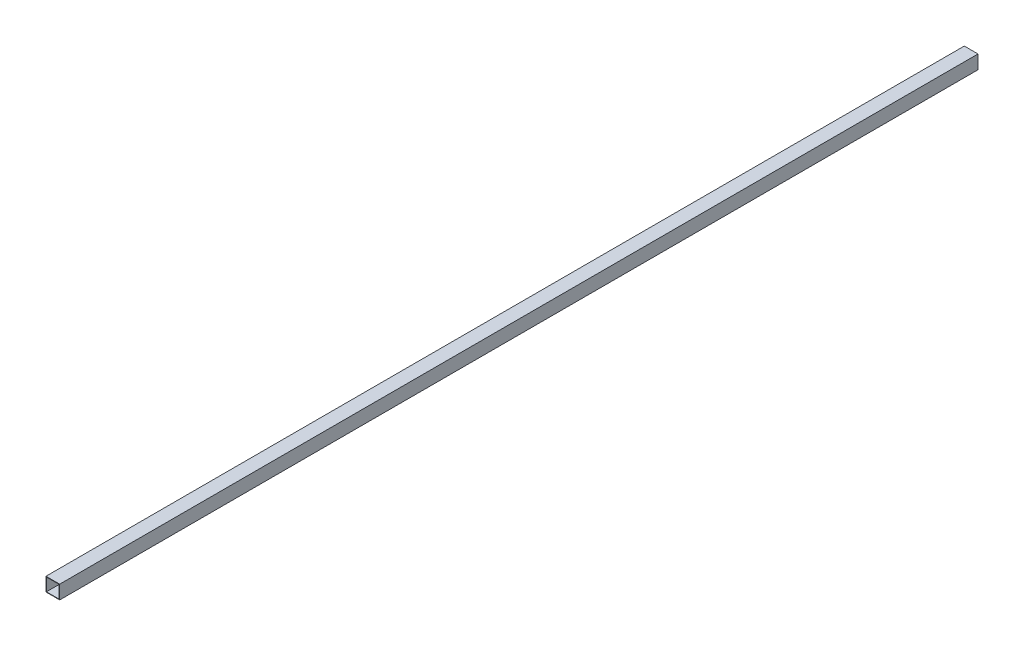
ISO-10303-21;
HEADER;
FILE_DESCRIPTION(('STEP AP214'),'2;1');
FILE_NAME('part.step','',(''),(''),'','','');
FILE_SCHEMA(('AUTOMOTIVE_DESIGN { 1 0 10303 214 1 1 1 1 }'));
ENDSEC;
DATA;
#1=APPLICATION_CONTEXT('core data for automotive mechanical design processes');
#2=APPLICATION_PROTOCOL_DEFINITION('international standard','automotive_design',2000,#1);
#3=PRODUCT_CONTEXT('',#1,'mechanical');
#4=PRODUCT('Part','Part','',(#3));
#5=PRODUCT_RELATED_PRODUCT_CATEGORY('part','',(#4));
#6=PRODUCT_DEFINITION_FORMATION('','',#4);
#7=PRODUCT_DEFINITION_CONTEXT('part definition',#1,'design');
#8=PRODUCT_DEFINITION('design','',#6,#7);
#9=PRODUCT_DEFINITION_SHAPE('','',#8);
#10=(LENGTH_UNIT() NAMED_UNIT(*) SI_UNIT(.MILLI.,.METRE.));
#11=(NAMED_UNIT(*) PLANE_ANGLE_UNIT() SI_UNIT($,.RADIAN.));
#12=(NAMED_UNIT(*) SI_UNIT($,.STERADIAN.) SOLID_ANGLE_UNIT());
#13=UNCERTAINTY_MEASURE_WITH_UNIT(LENGTH_MEASURE(1.E-05),#10,'distance_accuracy_value','');
#14=(GEOMETRIC_REPRESENTATION_CONTEXT(3) GLOBAL_UNCERTAINTY_ASSIGNED_CONTEXT((#13)) GLOBAL_UNIT_ASSIGNED_CONTEXT((#10,
#11,#12)) REPRESENTATION_CONTEXT('',''));
#15=CARTESIAN_POINT('',(0.,0.,0.));
#16=DIRECTION('',(0.,0.,1.));
#17=DIRECTION('',(1.,0.,0.));
#18=AXIS2_PLACEMENT_3D('',#15,#16,#17);
#19=CARTESIAN_POINT('',(-15.,-15.,1005.));
#20=DIRECTION('',(0.,0.,1.));
#21=DIRECTION('',(1.,0.,0.));
#22=AXIS2_PLACEMENT_3D('',#19,#20,#21);
#23=PLANE('',#22);
#24=DIRECTION('',(0.,-1.,0.));
#25=VECTOR('',#24,1.);
#26=CARTESIAN_POINT('',(-15.,-15.,1005.));
#27=LINE('',#26,#25);
#28=CARTESIAN_POINT('',(-15.,15.,1005.));
#29=VERTEX_POINT('',#28);
#30=CARTESIAN_POINT('',(-15.,-15.,1005.));
#31=VERTEX_POINT('',#30);
#32=EDGE_CURVE('E156',#29,#31,#27,.T.);
#33=ORIENTED_EDGE('',*,*,#32,.T.);
#34=DIRECTION('',(1.,0.,0.));
#35=VECTOR('',#34,1.);
#36=CARTESIAN_POINT('',(15.,-15.,1005.));
#37=LINE('',#36,#35);
#38=CARTESIAN_POINT('',(15.,-15.,1005.));
#39=VERTEX_POINT('',#38);
#40=EDGE_CURVE('E159',#31,#39,#37,.T.);
#41=ORIENTED_EDGE('',*,*,#40,.T.);
#42=DIRECTION('',(0.,1.,0.));
#43=VECTOR('',#42,1.);
#44=CARTESIAN_POINT('',(15.,-15.,1005.));
#45=LINE('',#44,#43);
#46=CARTESIAN_POINT('',(15.,15.,1005.));
#47=VERTEX_POINT('',#46);
#48=EDGE_CURVE('E162',#39,#47,#45,.T.);
#49=ORIENTED_EDGE('',*,*,#48,.T.);
#50=DIRECTION('',(-1.,0.,0.));
#51=VECTOR('',#50,1.);
#52=CARTESIAN_POINT('',(15.,15.,1005.));
#53=LINE('',#52,#51);
#54=EDGE_CURVE('E164',#47,#29,#53,.T.);
#55=ORIENTED_EDGE('',*,*,#54,.T.);
#56=EDGE_LOOP('',(#33,#41,#49,#55));
#57=FACE_BOUND('',#56,.T.);
#58=DIRECTION('',(1.,0.,0.));
#59=VECTOR('',#58,1.);
#60=CARTESIAN_POINT('',(15.,-14.,1005.));
#61=LINE('',#60,#59);
#62=CARTESIAN_POINT('',(-14.,-14.,1005.));
#63=VERTEX_POINT('',#62);
#64=CARTESIAN_POINT('',(14.,-14.,1005.));
#65=VERTEX_POINT('',#64);
#66=EDGE_CURVE('E128',#63,#65,#61,.T.);
#67=ORIENTED_EDGE('',*,*,#66,.F.);
#68=DIRECTION('',(0.,-1.,0.));
#69=VECTOR('',#68,1.);
#70=CARTESIAN_POINT('',(-14.,-15.,1005.));
#71=LINE('',#70,#69);
#72=CARTESIAN_POINT('',(-14.,14.,1005.));
#73=VERTEX_POINT('',#72);
#74=EDGE_CURVE('E120',#73,#63,#71,.T.);
#75=ORIENTED_EDGE('',*,*,#74,.F.);
#76=DIRECTION('',(-1.,0.,0.));
#77=VECTOR('',#76,1.);
#78=CARTESIAN_POINT('',(15.,14.,1005.));
#79=LINE('',#78,#77);
#80=CARTESIAN_POINT('',(14.,14.,1005.));
#81=VERTEX_POINT('',#80);
#82=EDGE_CURVE('E142',#81,#73,#79,.T.);
#83=ORIENTED_EDGE('',*,*,#82,.F.);
#84=DIRECTION('',(0.,1.,0.));
#85=VECTOR('',#84,1.);
#86=CARTESIAN_POINT('',(14.,-15.,1005.));
#87=LINE('',#86,#85);
#88=EDGE_CURVE('E140',#65,#81,#87,.T.);
#89=ORIENTED_EDGE('',*,*,#88,.F.);
#90=EDGE_LOOP('',(#67,#75,#83,#89));
#91=FACE_BOUND('',#90,.T.);
#92=ADVANCED_FACE('F55',(#57,#91),#23,.T.);
#93=CARTESIAN_POINT('',(-15.,-15.,-1005.));
#94=DIRECTION('',(0.,0.,1.));
#95=DIRECTION('',(1.,0.,0.));
#96=AXIS2_PLACEMENT_3D('',#93,#94,#95);
#97=PLANE('',#96);
#98=DIRECTION('',(0.,-1.,0.));
#99=VECTOR('',#98,1.);
#100=CARTESIAN_POINT('',(-15.,-15.,-1005.));
#101=LINE('',#100,#99);
#102=CARTESIAN_POINT('',(-15.,15.,-1005.));
#103=VERTEX_POINT('',#102);
#104=CARTESIAN_POINT('',(-15.,-15.,-1005.));
#105=VERTEX_POINT('',#104);
#106=EDGE_CURVE('E136',#103,#105,#101,.T.);
#107=ORIENTED_EDGE('',*,*,#106,.F.);
#108=DIRECTION('',(-1.,0.,0.));
#109=VECTOR('',#108,1.);
#110=CARTESIAN_POINT('',(15.,15.,-1005.));
#111=LINE('',#110,#109);
#112=CARTESIAN_POINT('',(15.,15.,-1005.));
#113=VERTEX_POINT('',#112);
#114=EDGE_CURVE('E160',#113,#103,#111,.T.);
#115=ORIENTED_EDGE('',*,*,#114,.F.);
#116=DIRECTION('',(0.,1.,0.));
#117=VECTOR('',#116,1.);
#118=CARTESIAN_POINT('',(15.,-15.,-1005.));
#119=LINE('',#118,#117);
#120=CARTESIAN_POINT('',(15.,-15.,-1005.));
#121=VERTEX_POINT('',#120);
#122=EDGE_CURVE('E171',#121,#113,#119,.T.);
#123=ORIENTED_EDGE('',*,*,#122,.F.);
#124=DIRECTION('',(1.,0.,0.));
#125=VECTOR('',#124,1.);
#126=CARTESIAN_POINT('',(15.,-15.,-1005.));
#127=LINE('',#126,#125);
#128=EDGE_CURVE('E169',#105,#121,#127,.T.);
#129=ORIENTED_EDGE('',*,*,#128,.F.);
#130=EDGE_LOOP('',(#107,#115,#123,#129));
#131=FACE_BOUND('',#130,.T.);
#132=DIRECTION('',(0.,-1.,0.));
#133=VECTOR('',#132,1.);
#134=CARTESIAN_POINT('',(-14.,-15.,-1005.));
#135=LINE('',#134,#133);
#136=CARTESIAN_POINT('',(-14.,14.,-1005.));
#137=VERTEX_POINT('',#136);
#138=CARTESIAN_POINT('',(-14.,-14.,-1005.));
#139=VERTEX_POINT('',#138);
#140=EDGE_CURVE('E78',#137,#139,#135,.T.);
#141=ORIENTED_EDGE('',*,*,#140,.T.);
#142=DIRECTION('',(1.,0.,0.));
#143=VECTOR('',#142,1.);
#144=CARTESIAN_POINT('',(15.,-14.,-1005.));
#145=LINE('',#144,#143);
#146=CARTESIAN_POINT('',(14.,-14.,-1005.));
#147=VERTEX_POINT('',#146);
#148=EDGE_CURVE('E135',#139,#147,#145,.T.);
#149=ORIENTED_EDGE('',*,*,#148,.T.);
#150=DIRECTION('',(0.,1.,0.));
#151=VECTOR('',#150,1.);
#152=CARTESIAN_POINT('',(14.,-15.,-1005.));
#153=LINE('',#152,#151);
#154=CARTESIAN_POINT('',(14.,14.,-1005.));
#155=VERTEX_POINT('',#154);
#156=EDGE_CURVE('E148',#147,#155,#153,.T.);
#157=ORIENTED_EDGE('',*,*,#156,.T.);
#158=DIRECTION('',(-1.,0.,0.));
#159=VECTOR('',#158,1.);
#160=CARTESIAN_POINT('',(15.,14.,-1005.));
#161=LINE('',#160,#159);
#162=EDGE_CURVE('E129',#155,#137,#161,.T.);
#163=ORIENTED_EDGE('',*,*,#162,.T.);
#164=EDGE_LOOP('',(#141,#149,#157,#163));
#165=FACE_BOUND('',#164,.T.);
#166=ADVANCED_FACE('F189',(#131,#165),#97,.F.);
#167=CARTESIAN_POINT('',(-15.,-15.,1005.));
#168=DIRECTION('',(1.,0.,0.));
#169=DIRECTION('',(0.,0.,-1.));
#170=AXIS2_PLACEMENT_3D('',#167,#168,#169);
#171=PLANE('',#170);
#172=ORIENTED_EDGE('',*,*,#106,.T.);
#173=DIRECTION('',(0.,0.,-1.));
#174=VECTOR('',#173,1.);
#175=CARTESIAN_POINT('',(-15.,-15.,1005.));
#176=LINE('',#175,#174);
#177=EDGE_CURVE('E12',#31,#105,#176,.T.);
#178=ORIENTED_EDGE('',*,*,#177,.F.);
#179=ORIENTED_EDGE('',*,*,#32,.F.);
#180=DIRECTION('',(0.,0.,-1.));
#181=VECTOR('',#180,1.);
#182=CARTESIAN_POINT('',(-15.,15.,1005.));
#183=LINE('',#182,#181);
#184=EDGE_CURVE('E166',#29,#103,#183,.T.);
#185=ORIENTED_EDGE('',*,*,#184,.T.);
#186=EDGE_LOOP('',(#172,#178,#179,#185));
#187=FACE_BOUND('',#186,.T.);
#188=ADVANCED_FACE('F57',(#187),#171,.F.);
#189=CARTESIAN_POINT('',(15.,-15.,1005.));
#190=DIRECTION('',(0.,1.,0.));
#191=DIRECTION('',(-1.,0.,0.));
#192=AXIS2_PLACEMENT_3D('',#189,#190,#191);
#193=PLANE('',#192);
#194=ORIENTED_EDGE('',*,*,#128,.T.);
#195=DIRECTION('',(0.,0.,-1.));
#196=VECTOR('',#195,1.);
#197=CARTESIAN_POINT('',(15.,-15.,1005.));
#198=LINE('',#197,#196);
#199=EDGE_CURVE('E63',#39,#121,#198,.T.);
#200=ORIENTED_EDGE('',*,*,#199,.F.);
#201=ORIENTED_EDGE('',*,*,#40,.F.);
#202=ORIENTED_EDGE('',*,*,#177,.T.);
#203=EDGE_LOOP('',(#194,#200,#201,#202));
#204=FACE_BOUND('',#203,.T.);
#205=ADVANCED_FACE('F199',(#204),#193,.F.);
#206=CARTESIAN_POINT('',(15.,-15.,1005.));
#207=DIRECTION('',(-1.,0.,0.));
#208=DIRECTION('',(0.,0.,1.));
#209=AXIS2_PLACEMENT_3D('',#206,#207,#208);
#210=PLANE('',#209);
#211=ORIENTED_EDGE('',*,*,#122,.T.);
#212=DIRECTION('',(0.,0.,-1.));
#213=VECTOR('',#212,1.);
#214=CARTESIAN_POINT('',(15.,15.,1005.));
#215=LINE('',#214,#213);
#216=EDGE_CURVE('E176',#47,#113,#215,.T.);
#217=ORIENTED_EDGE('',*,*,#216,.F.);
#218=ORIENTED_EDGE('',*,*,#48,.F.);
#219=ORIENTED_EDGE('',*,*,#199,.T.);
#220=EDGE_LOOP('',(#211,#217,#218,#219));
#221=FACE_BOUND('',#220,.T.);
#222=ADVANCED_FACE('F183',(#221),#210,.F.);
#223=CARTESIAN_POINT('',(15.,15.,1005.));
#224=DIRECTION('',(0.,-1.,0.));
#225=DIRECTION('',(1.,0.,0.));
#226=AXIS2_PLACEMENT_3D('',#223,#224,#225);
#227=PLANE('',#226);
#228=ORIENTED_EDGE('',*,*,#114,.T.);
#229=ORIENTED_EDGE('',*,*,#184,.F.);
#230=ORIENTED_EDGE('',*,*,#54,.F.);
#231=ORIENTED_EDGE('',*,*,#216,.T.);
#232=EDGE_LOOP('',(#228,#229,#230,#231));
#233=FACE_BOUND('',#232,.T.);
#234=ADVANCED_FACE('F193',(#233),#227,.F.);
#235=CARTESIAN_POINT('',(-14.,-15.,1005.));
#236=DIRECTION('',(1.,0.,0.));
#237=DIRECTION('',(0.,0.,-1.));
#238=AXIS2_PLACEMENT_3D('',#235,#236,#237);
#239=PLANE('',#238);
#240=ORIENTED_EDGE('',*,*,#140,.F.);
#241=DIRECTION('',(0.,0.,-1.));
#242=VECTOR('',#241,1.);
#243=CARTESIAN_POINT('',(-14.,14.,1005.));
#244=LINE('',#243,#242);
#245=EDGE_CURVE('E124',#73,#137,#244,.T.);
#246=ORIENTED_EDGE('',*,*,#245,.F.);
#247=ORIENTED_EDGE('',*,*,#74,.T.);
#248=DIRECTION('',(0.,0.,-1.));
#249=VECTOR('',#248,1.);
#250=CARTESIAN_POINT('',(-14.,-14.,1005.));
#251=LINE('',#250,#249);
#252=EDGE_CURVE('E123',#63,#139,#251,.T.);
#253=ORIENTED_EDGE('',*,*,#252,.T.);
#254=EDGE_LOOP('',(#240,#246,#247,#253));
#255=FACE_BOUND('',#254,.T.);
#256=ADVANCED_FACE('F122',(#255),#239,.T.);
#257=CARTESIAN_POINT('',(15.,-14.,1005.));
#258=DIRECTION('',(0.,1.,0.));
#259=DIRECTION('',(-1.,0.,0.));
#260=AXIS2_PLACEMENT_3D('',#257,#258,#259);
#261=PLANE('',#260);
#262=ORIENTED_EDGE('',*,*,#148,.F.);
#263=ORIENTED_EDGE('',*,*,#252,.F.);
#264=ORIENTED_EDGE('',*,*,#66,.T.);
#265=DIRECTION('',(0.,0.,-1.));
#266=VECTOR('',#265,1.);
#267=CARTESIAN_POINT('',(14.,-14.,1005.));
#268=LINE('',#267,#266);
#269=EDGE_CURVE('E137',#65,#147,#268,.T.);
#270=ORIENTED_EDGE('',*,*,#269,.T.);
#271=EDGE_LOOP('',(#262,#263,#264,#270));
#272=FACE_BOUND('',#271,.T.);
#273=ADVANCED_FACE('F132',(#272),#261,.T.);
#274=CARTESIAN_POINT('',(14.,-15.,1005.));
#275=DIRECTION('',(-1.,0.,0.));
#276=DIRECTION('',(0.,0.,1.));
#277=AXIS2_PLACEMENT_3D('',#274,#275,#276);
#278=PLANE('',#277);
#279=ORIENTED_EDGE('',*,*,#156,.F.);
#280=ORIENTED_EDGE('',*,*,#269,.F.);
#281=ORIENTED_EDGE('',*,*,#88,.T.);
#282=DIRECTION('',(0.,0.,-1.));
#283=VECTOR('',#282,1.);
#284=CARTESIAN_POINT('',(14.,14.,1005.));
#285=LINE('',#284,#283);
#286=EDGE_CURVE('E70',#81,#155,#285,.T.);
#287=ORIENTED_EDGE('',*,*,#286,.T.);
#288=EDGE_LOOP('',(#279,#280,#281,#287));
#289=FACE_BOUND('',#288,.T.);
#290=ADVANCED_FACE('F222',(#289),#278,.T.);
#291=CARTESIAN_POINT('',(15.,14.,1005.));
#292=DIRECTION('',(0.,-1.,0.));
#293=DIRECTION('',(1.,0.,0.));
#294=AXIS2_PLACEMENT_3D('',#291,#292,#293);
#295=PLANE('',#294);
#296=ORIENTED_EDGE('',*,*,#162,.F.);
#297=ORIENTED_EDGE('',*,*,#286,.F.);
#298=ORIENTED_EDGE('',*,*,#82,.T.);
#299=ORIENTED_EDGE('',*,*,#245,.T.);
#300=EDGE_LOOP('',(#296,#297,#298,#299));
#301=FACE_BOUND('',#300,.T.);
#302=ADVANCED_FACE('F226',(#301),#295,.T.);
#303=CLOSED_SHELL('',(#92,#166,#188,#205,#222,#234,#256,#273,#290,#302));
#304=MANIFOLD_SOLID_BREP('B2',#303);
#305=ADVANCED_BREP_SHAPE_REPRESENTATION('',(#18,#304),#14);
#306=SHAPE_DEFINITION_REPRESENTATION(#9,#305);
ENDSEC;
END-ISO-10303-21;
